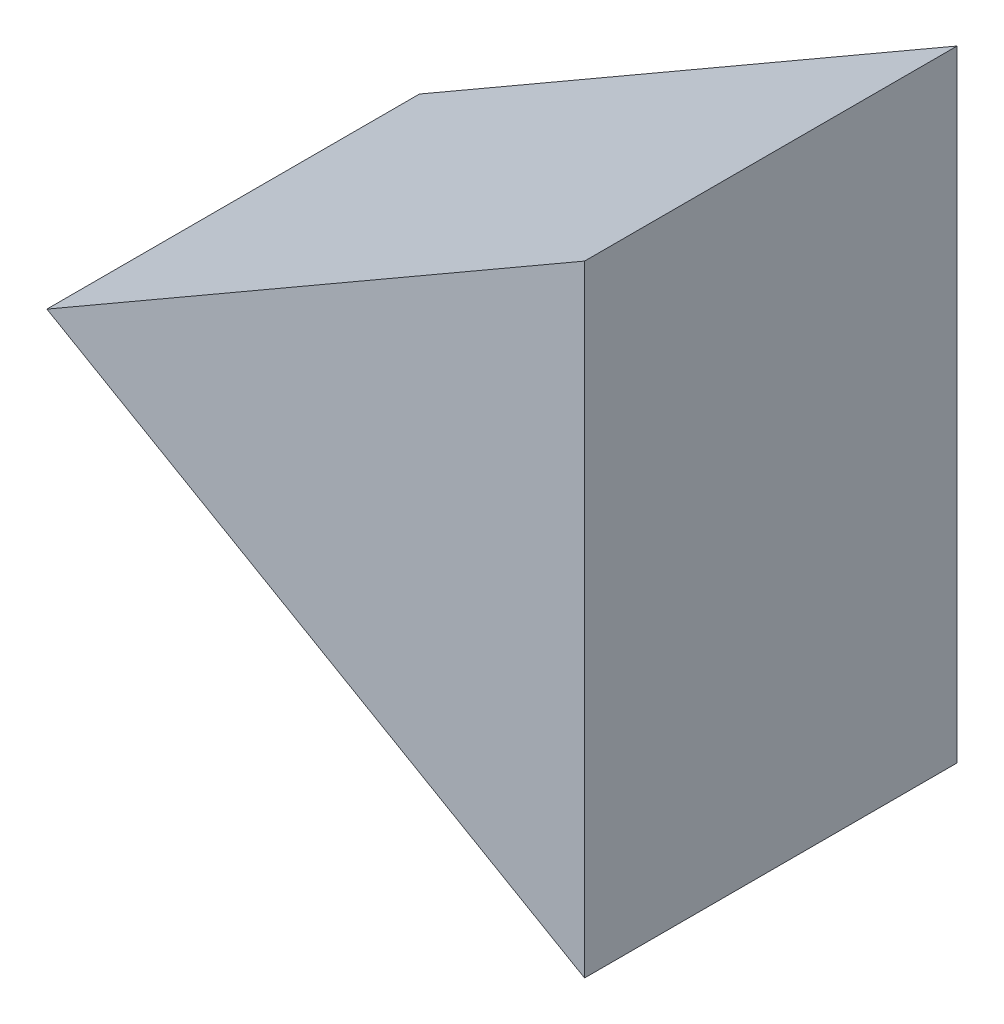
ISO-10303-21;
HEADER;
FILE_DESCRIPTION(('STEP AP214'),'2;1');
FILE_NAME('part.step','',(''),(''),'','','');
FILE_SCHEMA(('AUTOMOTIVE_DESIGN { 1 0 10303 214 1 1 1 1 }'));
ENDSEC;
DATA;
#1=APPLICATION_CONTEXT('core data for automotive mechanical design processes');
#2=APPLICATION_PROTOCOL_DEFINITION('international standard','automotive_design',2000,#1);
#3=PRODUCT_CONTEXT('',#1,'mechanical');
#4=PRODUCT('Part','Part','',(#3));
#5=PRODUCT_RELATED_PRODUCT_CATEGORY('part','',(#4));
#6=PRODUCT_DEFINITION_FORMATION('','',#4);
#7=PRODUCT_DEFINITION_CONTEXT('part definition',#1,'design');
#8=PRODUCT_DEFINITION('design','',#6,#7);
#9=PRODUCT_DEFINITION_SHAPE('','',#8);
#10=(LENGTH_UNIT() NAMED_UNIT(*) SI_UNIT(.MILLI.,.METRE.));
#11=(NAMED_UNIT(*) PLANE_ANGLE_UNIT() SI_UNIT($,.RADIAN.));
#12=(NAMED_UNIT(*) SI_UNIT($,.STERADIAN.) SOLID_ANGLE_UNIT());
#13=UNCERTAINTY_MEASURE_WITH_UNIT(LENGTH_MEASURE(1.E-05),#10,'distance_accuracy_value','');
#14=(GEOMETRIC_REPRESENTATION_CONTEXT(3) GLOBAL_UNCERTAINTY_ASSIGNED_CONTEXT((#13)) GLOBAL_UNIT_ASSIGNED_CONTEXT((#10,
#11,#12)) REPRESENTATION_CONTEXT('',''));
#15=CARTESIAN_POINT('',(0.,0.,0.));
#16=DIRECTION('',(0.,0.,1.));
#17=DIRECTION('',(1.,0.,0.));
#18=AXIS2_PLACEMENT_3D('',#15,#16,#17);
#19=CARTESIAN_POINT('',(866.025403784438,-499.999999999993,-300.));
#20=DIRECTION('',(0.499999999999995,0.866025403784442,0.));
#21=DIRECTION('',(-0.866025403784442,0.499999999999995,0.));
#22=AXIS2_PLACEMENT_3D('',#19,#20,#21);
#23=PLANE('',#22);
#24=DIRECTION('',(0.,0.,1.));
#25=VECTOR('',#24,1.);
#26=CARTESIAN_POINT('',(866.025403784438,-499.999999999993,-300.));
#27=LINE('',#26,#25);
#28=CARTESIAN_POINT('',(866.025403784438,-499.999999999993,-300.));
#29=VERTEX_POINT('',#28);
#30=CARTESIAN_POINT('',(866.025403784438,-499.999999999993,300.));
#31=VERTEX_POINT('',#30);
#32=EDGE_CURVE('E85',#29,#31,#27,.T.);
#33=ORIENTED_EDGE('',*,*,#32,.T.);
#34=DIRECTION('',(-0.866025403784442,0.499999999999995,0.));
#35=VECTOR('',#34,1.);
#36=CARTESIAN_POINT('',(866.025403784438,-499.999999999993,300.));
#37=LINE('',#36,#35);
#38=CARTESIAN_POINT('',(0.,0.,300.));
#39=VERTEX_POINT('',#38);
#40=EDGE_CURVE('E81',#31,#39,#37,.T.);
#41=ORIENTED_EDGE('',*,*,#40,.T.);
#42=DIRECTION('',(0.,0.,1.));
#43=VECTOR('',#42,1.);
#44=CARTESIAN_POINT('',(0.,0.,-300.));
#45=LINE('',#44,#43);
#46=CARTESIAN_POINT('',(0.,0.,-300.));
#47=VERTEX_POINT('',#46);
#48=EDGE_CURVE('E11',#47,#39,#45,.T.);
#49=ORIENTED_EDGE('',*,*,#48,.F.);
#50=DIRECTION('',(-0.866025403784442,0.499999999999995,0.));
#51=VECTOR('',#50,1.);
#52=CARTESIAN_POINT('',(866.025403784438,-499.999999999993,-300.));
#53=LINE('',#52,#51);
#54=EDGE_CURVE('E89',#29,#47,#53,.T.);
#55=ORIENTED_EDGE('',*,*,#54,.F.);
#56=EDGE_LOOP('',(#33,#41,#49,#55));
#57=FACE_BOUND('',#56,.T.);
#58=ADVANCED_FACE('F39',(#57),#23,.F.);
#59=CARTESIAN_POINT('',(0.,0.,-300.));
#60=DIRECTION('',(0.500000000000001,-0.866025403784438,0.));
#61=DIRECTION('',(0.866025403784438,0.500000000000001,0.));
#62=AXIS2_PLACEMENT_3D('',#59,#60,#61);
#63=PLANE('',#62);
#64=ORIENTED_EDGE('',*,*,#48,.T.);
#65=DIRECTION('',(0.866025403784438,0.500000000000001,0.));
#66=VECTOR('',#65,1.);
#67=CARTESIAN_POINT('',(0.,0.,300.));
#68=LINE('',#67,#66);
#69=CARTESIAN_POINT('',(866.025403784438,500.000000000001,300.));
#70=VERTEX_POINT('',#69);
#71=EDGE_CURVE('E73',#39,#70,#68,.T.);
#72=ORIENTED_EDGE('',*,*,#71,.T.);
#73=DIRECTION('',(0.,0.,1.));
#74=VECTOR('',#73,1.);
#75=CARTESIAN_POINT('',(866.025403784438,500.000000000001,-300.));
#76=LINE('',#75,#74);
#77=CARTESIAN_POINT('',(866.025403784438,500.000000000001,-300.));
#78=VERTEX_POINT('',#77);
#79=EDGE_CURVE('E46',#78,#70,#76,.T.);
#80=ORIENTED_EDGE('',*,*,#79,.F.);
#81=DIRECTION('',(0.866025403784438,0.500000000000001,0.));
#82=VECTOR('',#81,1.);
#83=CARTESIAN_POINT('',(0.,0.,-300.));
#84=LINE('',#83,#82);
#85=EDGE_CURVE('E57',#47,#78,#84,.T.);
#86=ORIENTED_EDGE('',*,*,#85,.F.);
#87=EDGE_LOOP('',(#64,#72,#80,#86));
#88=FACE_BOUND('',#87,.T.);
#89=ADVANCED_FACE('F72',(#88),#63,.F.);
#90=CARTESIAN_POINT('',(866.025403784438,500.000000000001,-300.));
#91=DIRECTION('',(-1.,0.,0.));
#92=DIRECTION('',(0.,-1.,0.));
#93=AXIS2_PLACEMENT_3D('',#90,#91,#92);
#94=PLANE('',#93);
#95=ORIENTED_EDGE('',*,*,#79,.T.);
#96=DIRECTION('',(0.,-1.,0.));
#97=VECTOR('',#96,1.);
#98=CARTESIAN_POINT('',(866.025403784438,500.000000000001,300.));
#99=LINE('',#98,#97);
#100=EDGE_CURVE('E83',#70,#31,#99,.T.);
#101=ORIENTED_EDGE('',*,*,#100,.T.);
#102=ORIENTED_EDGE('',*,*,#32,.F.);
#103=DIRECTION('',(0.,-1.,0.));
#104=VECTOR('',#103,1.);
#105=CARTESIAN_POINT('',(866.025403784438,500.000000000001,-300.));
#106=LINE('',#105,#104);
#107=EDGE_CURVE('E53',#78,#29,#106,.T.);
#108=ORIENTED_EDGE('',*,*,#107,.F.);
#109=EDGE_LOOP('',(#95,#101,#102,#108));
#110=FACE_BOUND('',#109,.T.);
#111=ADVANCED_FACE('F94',(#110),#94,.F.);
#112=CARTESIAN_POINT('',(0.,0.,-300.));
#113=DIRECTION('',(0.,0.,-1.));
#114=DIRECTION('',(-1.,0.,0.));
#115=AXIS2_PLACEMENT_3D('',#112,#113,#114);
#116=PLANE('',#115);
#117=ORIENTED_EDGE('',*,*,#54,.T.);
#118=ORIENTED_EDGE('',*,*,#85,.T.);
#119=ORIENTED_EDGE('',*,*,#107,.T.);
#120=EDGE_LOOP('',(#117,#118,#119));
#121=FACE_BOUND('',#120,.T.);
#122=ADVANCED_FACE('F95',(#121),#116,.T.);
#123=CARTESIAN_POINT('',(0.,0.,300.));
#124=DIRECTION('',(0.,0.,-1.));
#125=DIRECTION('',(-1.,0.,0.));
#126=AXIS2_PLACEMENT_3D('',#123,#124,#125);
#127=PLANE('',#126);
#128=ORIENTED_EDGE('',*,*,#40,.F.);
#129=ORIENTED_EDGE('',*,*,#100,.F.);
#130=ORIENTED_EDGE('',*,*,#71,.F.);
#131=EDGE_LOOP('',(#128,#129,#130));
#132=FACE_BOUND('',#131,.T.);
#133=ADVANCED_FACE('F80',(#132),#127,.F.);
#134=CLOSED_SHELL('',(#58,#89,#111,#122,#133));
#135=MANIFOLD_SOLID_BREP('B2',#134);
#136=ADVANCED_BREP_SHAPE_REPRESENTATION('',(#18,#135),#14);
#137=SHAPE_DEFINITION_REPRESENTATION(#9,#136);
ENDSEC;
END-ISO-10303-21;
